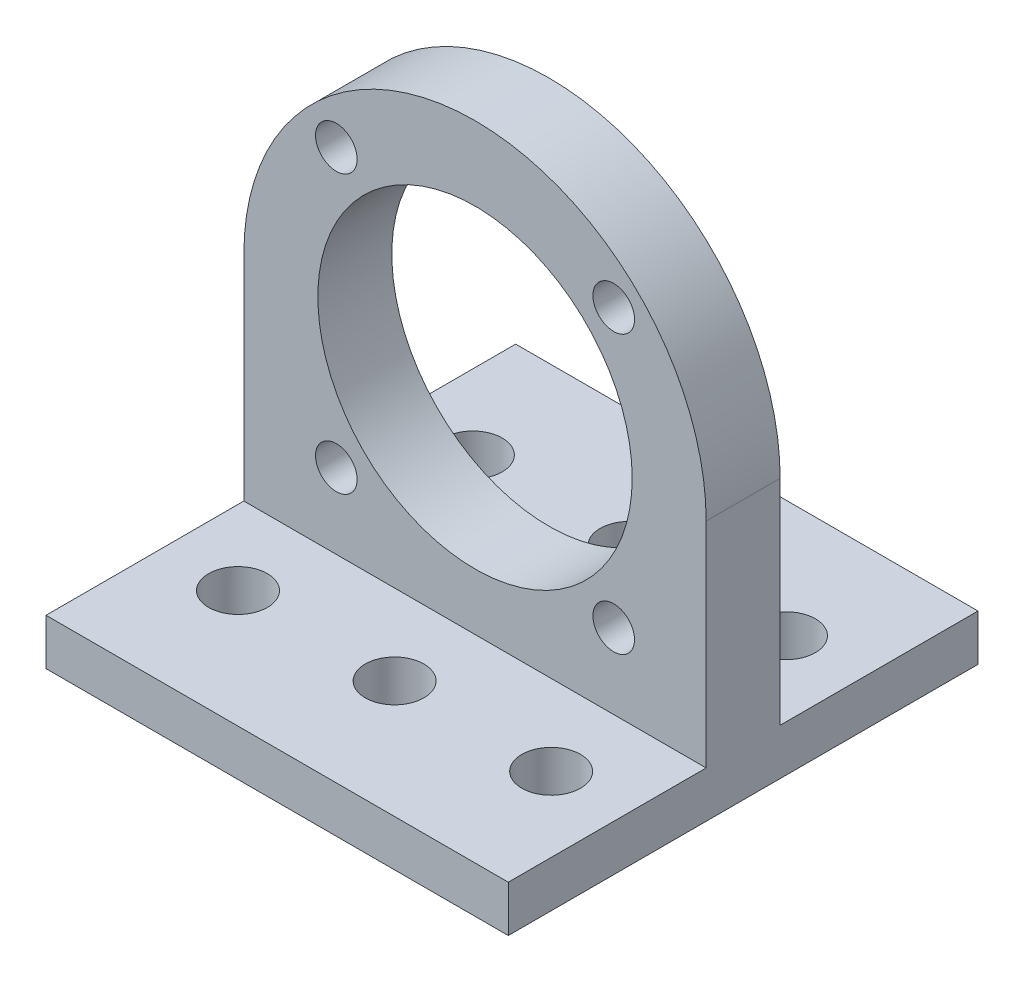
ISO-10303-21;
HEADER;
FILE_DESCRIPTION(('STEP AP214'),'2;1');
FILE_NAME('part.step','',(''),(''),'','','');
FILE_SCHEMA(('AUTOMOTIVE_DESIGN { 1 0 10303 214 1 1 1 1 }'));
ENDSEC;
DATA;
#1=APPLICATION_CONTEXT('core data for automotive mechanical design processes');
#2=APPLICATION_PROTOCOL_DEFINITION('international standard','automotive_design',2000,#1);
#3=PRODUCT_CONTEXT('',#1,'mechanical');
#4=PRODUCT('Part','Part','',(#3));
#5=PRODUCT_RELATED_PRODUCT_CATEGORY('part','',(#4));
#6=PRODUCT_DEFINITION_FORMATION('','',#4);
#7=PRODUCT_DEFINITION_CONTEXT('part definition',#1,'design');
#8=PRODUCT_DEFINITION('design','',#6,#7);
#9=PRODUCT_DEFINITION_SHAPE('','',#8);
#10=(LENGTH_UNIT() NAMED_UNIT(*) SI_UNIT(.MILLI.,.METRE.));
#11=(NAMED_UNIT(*) PLANE_ANGLE_UNIT() SI_UNIT($,.RADIAN.));
#12=(NAMED_UNIT(*) SI_UNIT($,.STERADIAN.) SOLID_ANGLE_UNIT());
#13=UNCERTAINTY_MEASURE_WITH_UNIT(LENGTH_MEASURE(1.E-05),#10,'distance_accuracy_value','');
#14=(GEOMETRIC_REPRESENTATION_CONTEXT(3) GLOBAL_UNCERTAINTY_ASSIGNED_CONTEXT((#13)) GLOBAL_UNIT_ASSIGNED_CONTEXT((#10,
#11,#12)) REPRESENTATION_CONTEXT('',''));
#15=CARTESIAN_POINT('',(0.,0.,0.));
#16=DIRECTION('',(0.,0.,1.));
#17=DIRECTION('',(1.,0.,0.));
#18=AXIS2_PLACEMENT_3D('',#15,#16,#17);
#19=CARTESIAN_POINT('',(0.,0.,0.));
#20=DIRECTION('',(0.,0.,1.));
#21=DIRECTION('',(1.,0.,0.));
#22=AXIS2_PLACEMENT_3D('',#19,#20,#21);
#23=PLANE('',#22);
#24=CARTESIAN_POINT('',(15.,15.,0.));
#25=DIRECTION('',(0.,0.,-1.));
#26=DIRECTION('',(-1.,0.,0.));
#27=AXIS2_PLACEMENT_3D('',#24,#25,#26);
#28=CIRCLE('',#27,2.25000000000001);
#29=CARTESIAN_POINT('',(12.75,15.,0.));
#30=VERTEX_POINT('',#29);
#31=EDGE_CURVE('E402',#30,#30,#28,.T.);
#32=ORIENTED_EDGE('',*,*,#31,.F.);
#33=EDGE_LOOP('',(#32));
#34=FACE_BOUND('',#33,.T.);
#35=DIRECTION('',(0.,1.,0.));
#36=VECTOR('',#35,1.);
#37=CARTESIAN_POINT('',(25.,0.,0.));
#38=LINE('',#37,#36);
#39=CARTESIAN_POINT('',(25.,-23.1305,0.));
#40=VERTEX_POINT('',#39);
#41=CARTESIAN_POINT('',(25.,0.,0.));
#42=VERTEX_POINT('',#41);
#43=EDGE_CURVE('E100',#40,#42,#38,.T.);
#44=ORIENTED_EDGE('',*,*,#43,.F.);
#45=DIRECTION('',(1.,0.,0.));
#46=VECTOR('',#45,1.);
#47=CARTESIAN_POINT('',(0.,-23.1305,0.));
#48=LINE('',#47,#46);
#49=CARTESIAN_POINT('',(-25.,-23.1305,0.));
#50=VERTEX_POINT('',#49);
#51=EDGE_CURVE('E73',#50,#40,#48,.T.);
#52=ORIENTED_EDGE('',*,*,#51,.F.);
#53=DIRECTION('',(0.,-1.,0.));
#54=VECTOR('',#53,1.);
#55=CARTESIAN_POINT('',(-25.,0.,0.));
#56=LINE('',#55,#54);
#57=CARTESIAN_POINT('',(-25.,0.,0.));
#58=VERTEX_POINT('',#57);
#59=EDGE_CURVE('E105',#58,#50,#56,.T.);
#60=ORIENTED_EDGE('',*,*,#59,.F.);
#61=CARTESIAN_POINT('',(0.,0.,0.));
#62=DIRECTION('',(0.,0.,1.));
#63=DIRECTION('',(1.,0.,0.));
#64=AXIS2_PLACEMENT_3D('',#61,#62,#63);
#65=CIRCLE('',#64,25.);
#66=EDGE_CURVE('E65',#42,#58,#65,.T.);
#67=ORIENTED_EDGE('',*,*,#66,.F.);
#68=EDGE_LOOP('',(#44,#52,#60,#67));
#69=FACE_BOUND('',#68,.T.);
#70=CARTESIAN_POINT('',(0.,0.,0.));
#71=DIRECTION('',(0.,0.,1.));
#72=DIRECTION('',(1.,0.,0.));
#73=AXIS2_PLACEMENT_3D('',#70,#71,#72);
#74=CIRCLE('',#73,17.);
#75=CARTESIAN_POINT('',(17.,0.,0.));
#76=VERTEX_POINT('',#75);
#77=EDGE_CURVE('E103',#76,#76,#74,.T.);
#78=ORIENTED_EDGE('',*,*,#77,.T.);
#79=EDGE_LOOP('',(#78));
#80=FACE_BOUND('',#79,.T.);
#81=CARTESIAN_POINT('',(-15.,-15.,0.));
#82=DIRECTION('',(0.,0.,-1.));
#83=DIRECTION('',(-1.,0.,0.));
#84=AXIS2_PLACEMENT_3D('',#81,#82,#83);
#85=CIRCLE('',#84,2.25000000000001);
#86=CARTESIAN_POINT('',(-17.25,-15.,0.));
#87=VERTEX_POINT('',#86);
#88=EDGE_CURVE('E146',#87,#87,#85,.T.);
#89=ORIENTED_EDGE('',*,*,#88,.F.);
#90=EDGE_LOOP('',(#89));
#91=FACE_BOUND('',#90,.T.);
#92=CARTESIAN_POINT('',(15.,-15.,0.));
#93=DIRECTION('',(0.,0.,-1.));
#94=DIRECTION('',(-1.,0.,0.));
#95=AXIS2_PLACEMENT_3D('',#92,#93,#94);
#96=CIRCLE('',#95,2.25000000000001);
#97=CARTESIAN_POINT('',(12.75,-15.,0.));
#98=VERTEX_POINT('',#97);
#99=EDGE_CURVE('E394',#98,#98,#96,.T.);
#100=ORIENTED_EDGE('',*,*,#99,.F.);
#101=EDGE_LOOP('',(#100));
#102=FACE_BOUND('',#101,.T.);
#103=CARTESIAN_POINT('',(-15.,15.,0.));
#104=DIRECTION('',(0.,0.,-1.));
#105=DIRECTION('',(-1.,0.,0.));
#106=AXIS2_PLACEMENT_3D('',#103,#104,#105);
#107=CIRCLE('',#106,2.25000000000001);
#108=CARTESIAN_POINT('',(-17.25,15.,0.));
#109=VERTEX_POINT('',#108);
#110=EDGE_CURVE('E397',#109,#109,#107,.T.);
#111=ORIENTED_EDGE('',*,*,#110,.F.);
#112=EDGE_LOOP('',(#111));
#113=FACE_BOUND('',#112,.T.);
#114=ADVANCED_FACE('F33',(#34,#69,#80,#91,#102,#113),#23,.F.);
#115=CARTESIAN_POINT('',(25.,0.,8.));
#116=DIRECTION('',(-1.,0.,0.));
#117=DIRECTION('',(0.,0.,1.));
#118=AXIS2_PLACEMENT_3D('',#115,#116,#117);
#119=PLANE('',#118);
#120=ORIENTED_EDGE('',*,*,#43,.T.);
#121=DIRECTION('',(0.,0.,-1.));
#122=VECTOR('',#121,1.);
#123=CARTESIAN_POINT('',(25.,0.,8.));
#124=LINE('',#123,#122);
#125=CARTESIAN_POINT('',(25.,0.,8.));
#126=VERTEX_POINT('',#125);
#127=EDGE_CURVE('E11',#126,#42,#124,.T.);
#128=ORIENTED_EDGE('',*,*,#127,.F.);
#129=DIRECTION('',(0.,1.,0.));
#130=VECTOR('',#129,1.);
#131=CARTESIAN_POINT('',(25.,0.,8.));
#132=LINE('',#131,#130);
#133=CARTESIAN_POINT('',(25.,-23.1305,8.));
#134=VERTEX_POINT('',#133);
#135=EDGE_CURVE('E91',#134,#126,#132,.T.);
#136=ORIENTED_EDGE('',*,*,#135,.F.);
#137=DIRECTION('',(0.,0.,1.));
#138=VECTOR('',#137,1.);
#139=CARTESIAN_POINT('',(25.,-23.1305,-21.4));
#140=LINE('',#139,#138);
#141=CARTESIAN_POINT('',(25.,-23.1305,29.4));
#142=VERTEX_POINT('',#141);
#143=EDGE_CURVE('E52',#134,#142,#140,.T.);
#144=ORIENTED_EDGE('',*,*,#143,.T.);
#145=DIRECTION('',(0.,1.,0.));
#146=VECTOR('',#145,1.);
#147=CARTESIAN_POINT('',(25.,-28.1305,29.4));
#148=LINE('',#147,#146);
#149=CARTESIAN_POINT('',(25.,-28.1305,29.4));
#150=VERTEX_POINT('',#149);
#151=EDGE_CURVE('E190',#150,#142,#148,.T.);
#152=ORIENTED_EDGE('',*,*,#151,.F.);
#153=DIRECTION('',(0.,0.,1.));
#154=VECTOR('',#153,1.);
#155=CARTESIAN_POINT('',(25.,-28.1305,-21.4));
#156=LINE('',#155,#154);
#157=CARTESIAN_POINT('',(25.,-28.1305,-21.4));
#158=VERTEX_POINT('',#157);
#159=EDGE_CURVE('E168',#158,#150,#156,.T.);
#160=ORIENTED_EDGE('',*,*,#159,.F.);
#161=DIRECTION('',(0.,1.,0.));
#162=VECTOR('',#161,1.);
#163=CARTESIAN_POINT('',(25.,-28.1305,-21.4));
#164=LINE('',#163,#162);
#165=CARTESIAN_POINT('',(25.,-23.1305,-21.4));
#166=VERTEX_POINT('',#165);
#167=EDGE_CURVE('E188',#158,#166,#164,.T.);
#168=ORIENTED_EDGE('',*,*,#167,.T.);
#169=EDGE_CURVE('E102',#166,#40,#140,.T.);
#170=ORIENTED_EDGE('',*,*,#169,.T.);
#171=EDGE_LOOP('',(#120,#128,#136,#144,#152,#160,#168,#170));
#172=FACE_BOUND('',#171,.T.);
#173=ADVANCED_FACE('F99',(#172),#119,.F.);
#174=CARTESIAN_POINT('',(0.,0.,8.));
#175=DIRECTION('',(0.,0.,-1.));
#176=DIRECTION('',(-1.,0.,0.));
#177=AXIS2_PLACEMENT_3D('',#174,#175,#176);
#178=CYLINDRICAL_SURFACE('',#177,25.);
#179=ORIENTED_EDGE('',*,*,#66,.T.);
#180=DIRECTION('',(0.,0.,-1.));
#181=VECTOR('',#180,1.);
#182=CARTESIAN_POINT('',(-25.,0.,8.));
#183=LINE('',#182,#181);
#184=CARTESIAN_POINT('',(-25.,0.,8.));
#185=VERTEX_POINT('',#184);
#186=EDGE_CURVE('E43',#185,#58,#183,.T.);
#187=ORIENTED_EDGE('',*,*,#186,.F.);
#188=CARTESIAN_POINT('',(0.,0.,8.));
#189=DIRECTION('',(0.,0.,1.));
#190=DIRECTION('',(1.,0.,0.));
#191=AXIS2_PLACEMENT_3D('',#188,#189,#190);
#192=CIRCLE('',#191,25.);
#193=EDGE_CURVE('E81',#126,#185,#192,.T.);
#194=ORIENTED_EDGE('',*,*,#193,.F.);
#195=ORIENTED_EDGE('',*,*,#127,.T.);
#196=EDGE_LOOP('',(#179,#187,#194,#195));
#197=FACE_BOUND('',#196,.T.);
#198=ADVANCED_FACE('F83',(#197),#178,.T.);
#199=CARTESIAN_POINT('',(-25.,0.,8.));
#200=DIRECTION('',(1.,0.,0.));
#201=DIRECTION('',(0.,0.,-1.));
#202=AXIS2_PLACEMENT_3D('',#199,#200,#201);
#203=PLANE('',#202);
#204=ORIENTED_EDGE('',*,*,#59,.T.);
#205=DIRECTION('',(0.,0.,-1.));
#206=VECTOR('',#205,1.);
#207=CARTESIAN_POINT('',(-25.,-23.1305,29.4));
#208=LINE('',#207,#206);
#209=CARTESIAN_POINT('',(-25.,-23.1305,-21.4));
#210=VERTEX_POINT('',#209);
#211=EDGE_CURVE('E119',#50,#210,#208,.T.);
#212=ORIENTED_EDGE('',*,*,#211,.T.);
#213=DIRECTION('',(0.,1.,0.));
#214=VECTOR('',#213,1.);
#215=CARTESIAN_POINT('',(-25.,-28.1305,-21.4));
#216=LINE('',#215,#214);
#217=CARTESIAN_POINT('',(-25.,-28.1305,-21.4));
#218=VERTEX_POINT('',#217);
#219=EDGE_CURVE('E108',#218,#210,#216,.T.);
#220=ORIENTED_EDGE('',*,*,#219,.F.);
#221=DIRECTION('',(0.,0.,-1.));
#222=VECTOR('',#221,1.);
#223=CARTESIAN_POINT('',(-25.,-28.1305,29.4));
#224=LINE('',#223,#222);
#225=CARTESIAN_POINT('',(-25.,-28.1305,29.4));
#226=VERTEX_POINT('',#225);
#227=EDGE_CURVE('E161',#226,#218,#224,.T.);
#228=ORIENTED_EDGE('',*,*,#227,.F.);
#229=DIRECTION('',(0.,1.,0.));
#230=VECTOR('',#229,1.);
#231=CARTESIAN_POINT('',(-25.,-28.1305,29.4));
#232=LINE('',#231,#230);
#233=CARTESIAN_POINT('',(-25.,-23.1305,29.4));
#234=VERTEX_POINT('',#233);
#235=EDGE_CURVE('E174',#226,#234,#232,.T.);
#236=ORIENTED_EDGE('',*,*,#235,.T.);
#237=CARTESIAN_POINT('',(-25.,-23.1305,8.));
#238=VERTEX_POINT('',#237);
#239=EDGE_CURVE('E183',#234,#238,#208,.T.);
#240=ORIENTED_EDGE('',*,*,#239,.T.);
#241=DIRECTION('',(0.,-1.,0.));
#242=VECTOR('',#241,1.);
#243=CARTESIAN_POINT('',(-25.,0.,8.));
#244=LINE('',#243,#242);
#245=EDGE_CURVE('E90',#185,#238,#244,.T.);
#246=ORIENTED_EDGE('',*,*,#245,.F.);
#247=ORIENTED_EDGE('',*,*,#186,.T.);
#248=EDGE_LOOP('',(#204,#212,#220,#228,#236,#240,#246,#247));
#249=FACE_BOUND('',#248,.T.);
#250=ADVANCED_FACE('F243',(#249),#203,.F.);
#251=CARTESIAN_POINT('',(0.,0.,8.));
#252=DIRECTION('',(0.,0.,-1.));
#253=DIRECTION('',(-1.,0.,0.));
#254=AXIS2_PLACEMENT_3D('',#251,#252,#253);
#255=CYLINDRICAL_SURFACE('',#254,17.);
#256=CARTESIAN_POINT('',(0.,0.,8.));
#257=DIRECTION('',(0.,0.,1.));
#258=DIRECTION('',(1.,0.,0.));
#259=AXIS2_PLACEMENT_3D('',#256,#257,#258);
#260=CIRCLE('',#259,17.);
#261=CARTESIAN_POINT('',(17.,0.,8.));
#262=VERTEX_POINT('',#261);
#263=EDGE_CURVE('E97',#262,#262,#260,.T.);
#264=ORIENTED_EDGE('',*,*,#263,.T.);
#265=EDGE_LOOP('',(#264));
#266=FACE_BOUND('',#265,.T.);
#267=ORIENTED_EDGE('',*,*,#77,.F.);
#268=EDGE_LOOP('',(#267));
#269=FACE_BOUND('',#268,.T.);
#270=ADVANCED_FACE('F35',(#266,#269),#255,.F.);
#271=CARTESIAN_POINT('',(0.,0.,8.));
#272=DIRECTION('',(0.,0.,1.));
#273=DIRECTION('',(1.,0.,0.));
#274=AXIS2_PLACEMENT_3D('',#271,#272,#273);
#275=PLANE('',#274);
#276=CARTESIAN_POINT('',(15.,15.,8.));
#277=DIRECTION('',(0.,0.,1.));
#278=DIRECTION('',(1.,0.,0.));
#279=AXIS2_PLACEMENT_3D('',#276,#277,#278);
#280=CIRCLE('',#279,2.25000000000001);
#281=CARTESIAN_POINT('',(17.25,15.,8.));
#282=VERTEX_POINT('',#281);
#283=EDGE_CURVE('E399',#282,#282,#280,.T.);
#284=ORIENTED_EDGE('',*,*,#283,.F.);
#285=EDGE_LOOP('',(#284));
#286=FACE_BOUND('',#285,.T.);
#287=CARTESIAN_POINT('',(-15.,15.,8.));
#288=DIRECTION('',(0.,0.,1.));
#289=DIRECTION('',(1.,0.,0.));
#290=AXIS2_PLACEMENT_3D('',#287,#288,#289);
#291=CIRCLE('',#290,2.25000000000001);
#292=CARTESIAN_POINT('',(-12.75,15.,8.));
#293=VERTEX_POINT('',#292);
#294=EDGE_CURVE('E37',#293,#293,#291,.T.);
#295=ORIENTED_EDGE('',*,*,#294,.F.);
#296=EDGE_LOOP('',(#295));
#297=FACE_BOUND('',#296,.T.);
#298=CARTESIAN_POINT('',(15.,-15.,8.));
#299=DIRECTION('',(0.,0.,1.));
#300=DIRECTION('',(1.,0.,0.));
#301=AXIS2_PLACEMENT_3D('',#298,#299,#300);
#302=CIRCLE('',#301,2.25000000000001);
#303=CARTESIAN_POINT('',(17.25,-15.,8.));
#304=VERTEX_POINT('',#303);
#305=EDGE_CURVE('E407',#304,#304,#302,.T.);
#306=ORIENTED_EDGE('',*,*,#305,.F.);
#307=EDGE_LOOP('',(#306));
#308=FACE_BOUND('',#307,.T.);
#309=CARTESIAN_POINT('',(-15.,-15.,8.));
#310=DIRECTION('',(0.,0.,1.));
#311=DIRECTION('',(1.,0.,0.));
#312=AXIS2_PLACEMENT_3D('',#309,#310,#311);
#313=CIRCLE('',#312,2.25000000000001);
#314=CARTESIAN_POINT('',(-12.75,-15.,8.));
#315=VERTEX_POINT('',#314);
#316=EDGE_CURVE('E141',#315,#315,#313,.T.);
#317=ORIENTED_EDGE('',*,*,#316,.F.);
#318=EDGE_LOOP('',(#317));
#319=FACE_BOUND('',#318,.T.);
#320=ORIENTED_EDGE('',*,*,#263,.F.);
#321=EDGE_LOOP('',(#320));
#322=FACE_BOUND('',#321,.T.);
#323=ORIENTED_EDGE('',*,*,#135,.T.);
#324=ORIENTED_EDGE('',*,*,#193,.T.);
#325=ORIENTED_EDGE('',*,*,#245,.T.);
#326=DIRECTION('',(1.,0.,0.));
#327=VECTOR('',#326,1.);
#328=CARTESIAN_POINT('',(0.,-23.1305,8.));
#329=LINE('',#328,#327);
#330=EDGE_CURVE('E95',#238,#134,#329,.T.);
#331=ORIENTED_EDGE('',*,*,#330,.T.);
#332=EDGE_LOOP('',(#323,#324,#325,#331));
#333=FACE_BOUND('',#332,.T.);
#334=ADVANCED_FACE('F94',(#286,#297,#308,#319,#322,#333),#275,.T.);
#335=CARTESIAN_POINT('',(0.,-23.1305,0.));
#336=DIRECTION('',(0.,-1.,0.));
#337=DIRECTION('',(1.,0.,0.));
#338=AXIS2_PLACEMENT_3D('',#335,#336,#337);
#339=PLANE('',#338);
#340=CARTESIAN_POINT('',(-16.9333333333333,-23.1305,-8.7));
#341=DIRECTION('',(0.,-1.,0.));
#342=DIRECTION('',(1.,0.,0.));
#343=AXIS2_PLACEMENT_3D('',#340,#341,#342);
#344=CIRCLE('',#343,3.17500000000001);
#345=CARTESIAN_POINT('',(-13.7583333333333,-23.1305,-8.7));
#346=VERTEX_POINT('',#345);
#347=EDGE_CURVE('E126',#346,#346,#344,.T.);
#348=ORIENTED_EDGE('',*,*,#347,.T.);
#349=EDGE_LOOP('',(#348));
#350=FACE_BOUND('',#349,.T.);
#351=CARTESIAN_POINT('',(0.,-23.1305,-8.69999999999999));
#352=DIRECTION('',(0.,-1.,0.));
#353=DIRECTION('',(1.,0.,0.));
#354=AXIS2_PLACEMENT_3D('',#351,#352,#353);
#355=CIRCLE('',#354,3.17500000000001);
#356=CARTESIAN_POINT('',(3.17500000000001,-23.1305,-8.69999999999999));
#357=VERTEX_POINT('',#356);
#358=EDGE_CURVE('E121',#357,#357,#355,.T.);
#359=ORIENTED_EDGE('',*,*,#358,.T.);
#360=EDGE_LOOP('',(#359));
#361=FACE_BOUND('',#360,.T.);
#362=CARTESIAN_POINT('',(16.9333333333333,-23.1305,-8.69999999999998));
#363=DIRECTION('',(0.,-1.,0.));
#364=DIRECTION('',(1.,0.,0.));
#365=AXIS2_PLACEMENT_3D('',#362,#363,#364);
#366=CIRCLE('',#365,3.17500000000001);
#367=CARTESIAN_POINT('',(20.1083333333333,-23.1305,-8.69999999999998));
#368=VERTEX_POINT('',#367);
#369=EDGE_CURVE('E116',#368,#368,#366,.T.);
#370=ORIENTED_EDGE('',*,*,#369,.T.);
#371=EDGE_LOOP('',(#370));
#372=FACE_BOUND('',#371,.T.);
#373=ORIENTED_EDGE('',*,*,#211,.F.);
#374=ORIENTED_EDGE('',*,*,#51,.T.);
#375=ORIENTED_EDGE('',*,*,#169,.F.);
#376=DIRECTION('',(1.,0.,0.));
#377=VECTOR('',#376,1.);
#378=CARTESIAN_POINT('',(-25.,-23.1305,-21.4));
#379=LINE('',#378,#377);
#380=EDGE_CURVE('E177',#210,#166,#379,.T.);
#381=ORIENTED_EDGE('',*,*,#380,.F.);
#382=EDGE_LOOP('',(#373,#374,#375,#381));
#383=FACE_BOUND('',#382,.T.);
#384=ADVANCED_FACE('F214',(#350,#361,#372,#383),#339,.F.);
#385=CARTESIAN_POINT('',(-25.,-28.1305,-21.4));
#386=DIRECTION('',(0.,0.,1.));
#387=DIRECTION('',(1.,0.,0.));
#388=AXIS2_PLACEMENT_3D('',#385,#386,#387);
#389=PLANE('',#388);
#390=ORIENTED_EDGE('',*,*,#380,.T.);
#391=ORIENTED_EDGE('',*,*,#167,.F.);
#392=DIRECTION('',(1.,0.,0.));
#393=VECTOR('',#392,1.);
#394=CARTESIAN_POINT('',(-25.,-28.1305,-21.4));
#395=LINE('',#394,#393);
#396=EDGE_CURVE('E164',#218,#158,#395,.T.);
#397=ORIENTED_EDGE('',*,*,#396,.F.);
#398=ORIENTED_EDGE('',*,*,#219,.T.);
#399=EDGE_LOOP('',(#390,#391,#397,#398));
#400=FACE_BOUND('',#399,.T.);
#401=ADVANCED_FACE('F207',(#400),#389,.F.);
#402=CARTESIAN_POINT('',(25.,-28.1305,29.4));
#403=DIRECTION('',(0.,0.,-1.));
#404=DIRECTION('',(-1.,0.,0.));
#405=AXIS2_PLACEMENT_3D('',#402,#403,#404);
#406=PLANE('',#405);
#407=DIRECTION('',(-1.,0.,0.));
#408=VECTOR('',#407,1.);
#409=CARTESIAN_POINT('',(25.,-23.1305,29.4));
#410=LINE('',#409,#408);
#411=EDGE_CURVE('E165',#142,#234,#410,.T.);
#412=ORIENTED_EDGE('',*,*,#411,.T.);
#413=ORIENTED_EDGE('',*,*,#235,.F.);
#414=DIRECTION('',(-1.,0.,0.));
#415=VECTOR('',#414,1.);
#416=CARTESIAN_POINT('',(25.,-28.1305,29.4));
#417=LINE('',#416,#415);
#418=EDGE_CURVE('E171',#150,#226,#417,.T.);
#419=ORIENTED_EDGE('',*,*,#418,.F.);
#420=ORIENTED_EDGE('',*,*,#151,.T.);
#421=EDGE_LOOP('',(#412,#413,#419,#420));
#422=FACE_BOUND('',#421,.T.);
#423=ADVANCED_FACE('F225',(#422),#406,.F.);
#424=CARTESIAN_POINT('',(0.,-28.1305,0.));
#425=DIRECTION('',(0.,-1.,0.));
#426=DIRECTION('',(1.,0.,0.));
#427=AXIS2_PLACEMENT_3D('',#424,#425,#426);
#428=PLANE('',#427);
#429=CARTESIAN_POINT('',(-16.9333333333333,-28.1305,16.7));
#430=DIRECTION('',(0.,-1.,0.));
#431=DIRECTION('',(0.,0.,-1.));
#432=AXIS2_PLACEMENT_3D('',#429,#430,#431);
#433=CIRCLE('',#432,3.17500000000001);
#434=CARTESIAN_POINT('',(-16.9333333333333,-28.1305,13.525));
#435=VERTEX_POINT('',#434);
#436=EDGE_CURVE('E135',#435,#435,#433,.T.);
#437=ORIENTED_EDGE('',*,*,#436,.F.);
#438=EDGE_LOOP('',(#437));
#439=FACE_BOUND('',#438,.T.);
#440=CARTESIAN_POINT('',(0.,-28.1305,16.7));
#441=DIRECTION('',(0.,-1.,0.));
#442=DIRECTION('',(0.,0.,-1.));
#443=AXIS2_PLACEMENT_3D('',#440,#441,#442);
#444=CIRCLE('',#443,3.17500000000001);
#445=CARTESIAN_POINT('',(0.,-28.1305,13.525));
#446=VERTEX_POINT('',#445);
#447=EDGE_CURVE('E132',#446,#446,#444,.T.);
#448=ORIENTED_EDGE('',*,*,#447,.F.);
#449=EDGE_LOOP('',(#448));
#450=FACE_BOUND('',#449,.T.);
#451=CARTESIAN_POINT('',(-16.9333333333333,-28.1305,-8.7));
#452=DIRECTION('',(0.,-1.,0.));
#453=DIRECTION('',(0.,0.,-1.));
#454=AXIS2_PLACEMENT_3D('',#451,#452,#453);
#455=CIRCLE('',#454,3.17500000000001);
#456=CARTESIAN_POINT('',(-16.9333333333333,-28.1305,-11.875));
#457=VERTEX_POINT('',#456);
#458=EDGE_CURVE('E129',#457,#457,#455,.T.);
#459=ORIENTED_EDGE('',*,*,#458,.F.);
#460=EDGE_LOOP('',(#459));
#461=FACE_BOUND('',#460,.T.);
#462=CARTESIAN_POINT('',(0.,-28.1305,-8.69999999999999));
#463=DIRECTION('',(0.,-1.,0.));
#464=DIRECTION('',(0.,0.,-1.));
#465=AXIS2_PLACEMENT_3D('',#462,#463,#464);
#466=CIRCLE('',#465,3.17500000000001);
#467=CARTESIAN_POINT('',(0.,-28.1305,-11.875));
#468=VERTEX_POINT('',#467);
#469=EDGE_CURVE('E125',#468,#468,#466,.T.);
#470=ORIENTED_EDGE('',*,*,#469,.F.);
#471=EDGE_LOOP('',(#470));
#472=FACE_BOUND('',#471,.T.);
#473=CARTESIAN_POINT('',(16.9333333333333,-28.1305,16.7));
#474=DIRECTION('',(0.,-1.,0.));
#475=DIRECTION('',(0.,0.,-1.));
#476=AXIS2_PLACEMENT_3D('',#473,#474,#475);
#477=CIRCLE('',#476,3.17500000000001);
#478=CARTESIAN_POINT('',(16.9333333333333,-28.1305,13.525));
#479=VERTEX_POINT('',#478);
#480=EDGE_CURVE('E124',#479,#479,#477,.T.);
#481=ORIENTED_EDGE('',*,*,#480,.F.);
#482=EDGE_LOOP('',(#481));
#483=FACE_BOUND('',#482,.T.);
#484=CARTESIAN_POINT('',(16.9333333333333,-28.1305,-8.69999999999998));
#485=DIRECTION('',(0.,-1.,0.));
#486=DIRECTION('',(0.,0.,-1.));
#487=AXIS2_PLACEMENT_3D('',#484,#485,#486);
#488=CIRCLE('',#487,3.17500000000001);
#489=CARTESIAN_POINT('',(16.9333333333333,-28.1305,-11.875));
#490=VERTEX_POINT('',#489);
#491=EDGE_CURVE('E120',#490,#490,#488,.T.);
#492=ORIENTED_EDGE('',*,*,#491,.F.);
#493=EDGE_LOOP('',(#492));
#494=FACE_BOUND('',#493,.T.);
#495=ORIENTED_EDGE('',*,*,#227,.T.);
#496=ORIENTED_EDGE('',*,*,#396,.T.);
#497=ORIENTED_EDGE('',*,*,#159,.T.);
#498=ORIENTED_EDGE('',*,*,#418,.T.);
#499=EDGE_LOOP('',(#495,#496,#497,#498));
#500=FACE_BOUND('',#499,.T.);
#501=ADVANCED_FACE('F234',(#439,#450,#461,#472,#483,#494,#500),#428,.T.);
#502=CARTESIAN_POINT('',(-16.9333333333333,-23.1305,16.7));
#503=DIRECTION('',(0.,-1.,0.));
#504=DIRECTION('',(1.,0.,0.));
#505=AXIS2_PLACEMENT_3D('',#502,#503,#504);
#506=CIRCLE('',#505,3.17500000000001);
#507=CARTESIAN_POINT('',(-13.7583333333333,-23.1305,16.7));
#508=VERTEX_POINT('',#507);
#509=EDGE_CURVE('E133',#508,#508,#506,.T.);
#510=ORIENTED_EDGE('',*,*,#509,.T.);
#511=EDGE_LOOP('',(#510));
#512=FACE_BOUND('',#511,.T.);
#513=CARTESIAN_POINT('',(0.,-23.1305,16.7));
#514=DIRECTION('',(0.,-1.,0.));
#515=DIRECTION('',(1.,0.,0.));
#516=AXIS2_PLACEMENT_3D('',#513,#514,#515);
#517=CIRCLE('',#516,3.17500000000001);
#518=CARTESIAN_POINT('',(3.175,-23.1305,16.7));
#519=VERTEX_POINT('',#518);
#520=EDGE_CURVE('E130',#519,#519,#517,.T.);
#521=ORIENTED_EDGE('',*,*,#520,.T.);
#522=EDGE_LOOP('',(#521));
#523=FACE_BOUND('',#522,.T.);
#524=CARTESIAN_POINT('',(16.9333333333333,-23.1305,16.7));
#525=DIRECTION('',(0.,-1.,0.));
#526=DIRECTION('',(1.,0.,0.));
#527=AXIS2_PLACEMENT_3D('',#524,#525,#526);
#528=CIRCLE('',#527,3.17500000000001);
#529=CARTESIAN_POINT('',(20.1083333333333,-23.1305,16.7));
#530=VERTEX_POINT('',#529);
#531=EDGE_CURVE('E156',#530,#530,#528,.T.);
#532=ORIENTED_EDGE('',*,*,#531,.T.);
#533=EDGE_LOOP('',(#532));
#534=FACE_BOUND('',#533,.T.);
#535=ORIENTED_EDGE('',*,*,#330,.F.);
#536=ORIENTED_EDGE('',*,*,#239,.F.);
#537=ORIENTED_EDGE('',*,*,#411,.F.);
#538=ORIENTED_EDGE('',*,*,#143,.F.);
#539=EDGE_LOOP('',(#535,#536,#537,#538));
#540=FACE_BOUND('',#539,.T.);
#541=ADVANCED_FACE('F220',(#512,#523,#534,#540),#339,.F.);
#542=CARTESIAN_POINT('',(16.9333333333333,-28.1305,-8.69999999999998));
#543=DIRECTION('',(0.,-1.,0.));
#544=DIRECTION('',(0.,0.,-1.));
#545=AXIS2_PLACEMENT_3D('',#542,#543,#544);
#546=CYLINDRICAL_SURFACE('',#545,3.17500000000001);
#547=ORIENTED_EDGE('',*,*,#491,.T.);
#548=EDGE_LOOP('',(#547));
#549=FACE_BOUND('',#548,.T.);
#550=ORIENTED_EDGE('',*,*,#369,.F.);
#551=EDGE_LOOP('',(#550));
#552=FACE_BOUND('',#551,.T.);
#553=ADVANCED_FACE('F233',(#549,#552),#546,.F.);
#554=CARTESIAN_POINT('',(16.9333333333333,-28.1305,16.7));
#555=DIRECTION('',(0.,-1.,0.));
#556=DIRECTION('',(0.,0.,-1.));
#557=AXIS2_PLACEMENT_3D('',#554,#555,#556);
#558=CYLINDRICAL_SURFACE('',#557,3.17500000000001);
#559=ORIENTED_EDGE('',*,*,#480,.T.);
#560=EDGE_LOOP('',(#559));
#561=FACE_BOUND('',#560,.T.);
#562=ORIENTED_EDGE('',*,*,#531,.F.);
#563=EDGE_LOOP('',(#562));
#564=FACE_BOUND('',#563,.T.);
#565=ADVANCED_FACE('F332',(#561,#564),#558,.F.);
#566=CARTESIAN_POINT('',(0.,-28.1305,-8.69999999999999));
#567=DIRECTION('',(0.,-1.,0.));
#568=DIRECTION('',(0.,0.,-1.));
#569=AXIS2_PLACEMENT_3D('',#566,#567,#568);
#570=CYLINDRICAL_SURFACE('',#569,3.17500000000001);
#571=ORIENTED_EDGE('',*,*,#469,.T.);
#572=EDGE_LOOP('',(#571));
#573=FACE_BOUND('',#572,.T.);
#574=ORIENTED_EDGE('',*,*,#358,.F.);
#575=EDGE_LOOP('',(#574));
#576=FACE_BOUND('',#575,.T.);
#577=ADVANCED_FACE('F328',(#573,#576),#570,.F.);
#578=CARTESIAN_POINT('',(-16.9333333333333,-28.1305,-8.7));
#579=DIRECTION('',(0.,-1.,0.));
#580=DIRECTION('',(0.,0.,-1.));
#581=AXIS2_PLACEMENT_3D('',#578,#579,#580);
#582=CYLINDRICAL_SURFACE('',#581,3.17500000000001);
#583=ORIENTED_EDGE('',*,*,#458,.T.);
#584=EDGE_LOOP('',(#583));
#585=FACE_BOUND('',#584,.T.);
#586=ORIENTED_EDGE('',*,*,#347,.F.);
#587=EDGE_LOOP('',(#586));
#588=FACE_BOUND('',#587,.T.);
#589=ADVANCED_FACE('F324',(#585,#588),#582,.F.);
#590=CARTESIAN_POINT('',(0.,-28.1305,16.7));
#591=DIRECTION('',(0.,-1.,0.));
#592=DIRECTION('',(0.,0.,-1.));
#593=AXIS2_PLACEMENT_3D('',#590,#591,#592);
#594=CYLINDRICAL_SURFACE('',#593,3.17500000000001);
#595=ORIENTED_EDGE('',*,*,#447,.T.);
#596=EDGE_LOOP('',(#595));
#597=FACE_BOUND('',#596,.T.);
#598=ORIENTED_EDGE('',*,*,#520,.F.);
#599=EDGE_LOOP('',(#598));
#600=FACE_BOUND('',#599,.T.);
#601=ADVANCED_FACE('F321',(#597,#600),#594,.F.);
#602=CARTESIAN_POINT('',(-16.9333333333333,-28.1305,16.7));
#603=DIRECTION('',(0.,-1.,0.));
#604=DIRECTION('',(0.,0.,-1.));
#605=AXIS2_PLACEMENT_3D('',#602,#603,#604);
#606=CYLINDRICAL_SURFACE('',#605,3.17500000000001);
#607=ORIENTED_EDGE('',*,*,#436,.T.);
#608=EDGE_LOOP('',(#607));
#609=FACE_BOUND('',#608,.T.);
#610=ORIENTED_EDGE('',*,*,#509,.F.);
#611=EDGE_LOOP('',(#610));
#612=FACE_BOUND('',#611,.T.);
#613=ADVANCED_FACE('F282',(#609,#612),#606,.F.);
#614=CARTESIAN_POINT('',(-15.,-15.,0.));
#615=DIRECTION('',(0.,0.,-1.));
#616=DIRECTION('',(-1.,0.,0.));
#617=AXIS2_PLACEMENT_3D('',#614,#615,#616);
#618=CYLINDRICAL_SURFACE('',#617,2.25000000000001);
#619=ORIENTED_EDGE('',*,*,#316,.T.);
#620=EDGE_LOOP('',(#619));
#621=FACE_BOUND('',#620,.T.);
#622=ORIENTED_EDGE('',*,*,#88,.T.);
#623=EDGE_LOOP('',(#622));
#624=FACE_BOUND('',#623,.T.);
#625=ADVANCED_FACE('F276',(#621,#624),#618,.F.);
#626=CARTESIAN_POINT('',(15.,-15.,0.));
#627=DIRECTION('',(0.,0.,-1.));
#628=DIRECTION('',(-1.,0.,0.));
#629=AXIS2_PLACEMENT_3D('',#626,#627,#628);
#630=CYLINDRICAL_SURFACE('',#629,2.25000000000001);
#631=ORIENTED_EDGE('',*,*,#305,.T.);
#632=EDGE_LOOP('',(#631));
#633=FACE_BOUND('',#632,.T.);
#634=ORIENTED_EDGE('',*,*,#99,.T.);
#635=EDGE_LOOP('',(#634));
#636=FACE_BOUND('',#635,.T.);
#637=ADVANCED_FACE('F281',(#633,#636),#630,.F.);
#638=CARTESIAN_POINT('',(-15.,15.,0.));
#639=DIRECTION('',(0.,0.,-1.));
#640=DIRECTION('',(-1.,0.,0.));
#641=AXIS2_PLACEMENT_3D('',#638,#639,#640);
#642=CYLINDRICAL_SURFACE('',#641,2.25000000000001);
#643=ORIENTED_EDGE('',*,*,#294,.T.);
#644=EDGE_LOOP('',(#643));
#645=FACE_BOUND('',#644,.T.);
#646=ORIENTED_EDGE('',*,*,#110,.T.);
#647=EDGE_LOOP('',(#646));
#648=FACE_BOUND('',#647,.T.);
#649=ADVANCED_FACE('F293',(#645,#648),#642,.F.);
#650=CARTESIAN_POINT('',(15.,15.,0.));
#651=DIRECTION('',(0.,0.,-1.));
#652=DIRECTION('',(-1.,0.,0.));
#653=AXIS2_PLACEMENT_3D('',#650,#651,#652);
#654=CYLINDRICAL_SURFACE('',#653,2.25000000000001);
#655=ORIENTED_EDGE('',*,*,#283,.T.);
#656=EDGE_LOOP('',(#655));
#657=FACE_BOUND('',#656,.T.);
#658=ORIENTED_EDGE('',*,*,#31,.T.);
#659=EDGE_LOOP('',(#658));
#660=FACE_BOUND('',#659,.T.);
#661=ADVANCED_FACE('F303',(#657,#660),#654,.F.);
#662=CLOSED_SHELL('',(#114,#173,#198,#250,#270,#334,#384,#401,#423,#501,#541,#553,#565,#577,
#589,#601,#613,#625,#637,#649,#661));
#663=MANIFOLD_SOLID_BREP('B2',#662);
#664=ADVANCED_BREP_SHAPE_REPRESENTATION('',(#18,#663),#14);
#665=SHAPE_DEFINITION_REPRESENTATION(#9,#664);
ENDSEC;
END-ISO-10303-21;
